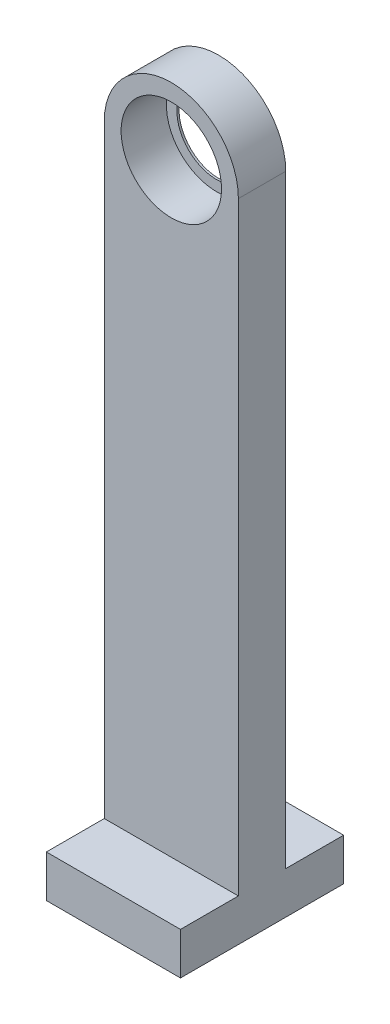
ISO-10303-21;
HEADER;
FILE_DESCRIPTION(('STEP AP214'),'2;1');
FILE_NAME('part.step','',(''),(''),'','','');
FILE_SCHEMA(('AUTOMOTIVE_DESIGN { 1 0 10303 214 1 1 1 1 }'));
ENDSEC;
DATA;
#1=APPLICATION_CONTEXT('core data for automotive mechanical design processes');
#2=APPLICATION_PROTOCOL_DEFINITION('international standard','automotive_design',2000,#1);
#3=PRODUCT_CONTEXT('',#1,'mechanical');
#4=PRODUCT('Part','Part','',(#3));
#5=PRODUCT_RELATED_PRODUCT_CATEGORY('part','',(#4));
#6=PRODUCT_DEFINITION_FORMATION('','',#4);
#7=PRODUCT_DEFINITION_CONTEXT('part definition',#1,'design');
#8=PRODUCT_DEFINITION('design','',#6,#7);
#9=PRODUCT_DEFINITION_SHAPE('','',#8);
#10=(LENGTH_UNIT() NAMED_UNIT(*) SI_UNIT(.MILLI.,.METRE.));
#11=(NAMED_UNIT(*) PLANE_ANGLE_UNIT() SI_UNIT($,.RADIAN.));
#12=(NAMED_UNIT(*) SI_UNIT($,.STERADIAN.) SOLID_ANGLE_UNIT());
#13=UNCERTAINTY_MEASURE_WITH_UNIT(LENGTH_MEASURE(1.E-05),#10,'distance_accuracy_value','');
#14=(GEOMETRIC_REPRESENTATION_CONTEXT(3) GLOBAL_UNCERTAINTY_ASSIGNED_CONTEXT((#13)) GLOBAL_UNIT_ASSIGNED_CONTEXT((#10,
#11,#12)) REPRESENTATION_CONTEXT('',''));
#15=CARTESIAN_POINT('',(0.,0.,0.));
#16=DIRECTION('',(0.,0.,1.));
#17=DIRECTION('',(1.,0.,0.));
#18=AXIS2_PLACEMENT_3D('',#15,#16,#17);
#19=CARTESIAN_POINT('',(0.,0.,4.5));
#20=DIRECTION('',(0.,0.,1.));
#21=DIRECTION('',(1.,0.,0.));
#22=AXIS2_PLACEMENT_3D('',#19,#20,#21);
#23=PLANE('',#22);
#24=DIRECTION('',(-1.,0.,0.));
#25=VECTOR('',#24,1.);
#26=CARTESIAN_POINT('',(0.,-57.37,4.5));
#27=LINE('',#26,#25);
#28=CARTESIAN_POINT('',(6.37005528205707,-57.37,4.5));
#29=VERTEX_POINT('',#28);
#30=CARTESIAN_POINT('',(-6.37005528205707,-57.37,4.5));
#31=VERTEX_POINT('',#30);
#32=EDGE_CURVE('E132',#29,#31,#27,.T.);
#33=ORIENTED_EDGE('',*,*,#32,.F.);
#34=DIRECTION('',(0.,-1.,0.));
#35=VECTOR('',#34,1.);
#36=CARTESIAN_POINT('',(6.37005528205707,0.,4.5));
#37=LINE('',#36,#35);
#38=CARTESIAN_POINT('',(6.37005528205707,0.,4.5));
#39=VERTEX_POINT('',#38);
#40=EDGE_CURVE('E134',#39,#29,#37,.T.);
#41=ORIENTED_EDGE('',*,*,#40,.F.);
#42=CARTESIAN_POINT('',(0.,0.,4.5));
#43=DIRECTION('',(0.,0.,1.));
#44=DIRECTION('',(1.,0.,0.));
#45=AXIS2_PLACEMENT_3D('',#42,#43,#44);
#46=CIRCLE('',#45,6.37005528205707);
#47=CARTESIAN_POINT('',(-6.37005528205707,0.,4.5));
#48=VERTEX_POINT('',#47);
#49=EDGE_CURVE('E24',#39,#48,#46,.T.);
#50=ORIENTED_EDGE('',*,*,#49,.T.);
#51=DIRECTION('',(0.,1.,0.));
#52=VECTOR('',#51,1.);
#53=CARTESIAN_POINT('',(-6.37005528205707,0.,4.5));
#54=LINE('',#53,#52);
#55=EDGE_CURVE('E90',#31,#48,#54,.T.);
#56=ORIENTED_EDGE('',*,*,#55,.F.);
#57=EDGE_LOOP('',(#33,#41,#50,#56));
#58=FACE_BOUND('',#57,.T.);
#59=CARTESIAN_POINT('',(0.,0.,4.5));
#60=DIRECTION('',(0.,0.,1.));
#61=DIRECTION('',(1.,0.,0.));
#62=AXIS2_PLACEMENT_3D('',#59,#60,#61);
#63=CIRCLE('',#62,4.77);
#64=CARTESIAN_POINT('',(4.77,0.,4.5));
#65=VERTEX_POINT('',#64);
#66=EDGE_CURVE('E147',#65,#65,#63,.T.);
#67=ORIENTED_EDGE('',*,*,#66,.F.);
#68=EDGE_LOOP('',(#67));
#69=FACE_BOUND('',#68,.T.);
#70=ADVANCED_FACE('F16',(#58,#69),#23,.T.);
#71=CARTESIAN_POINT('',(0.,0.,0.));
#72=DIRECTION('',(0.,0.,1.));
#73=DIRECTION('',(1.,0.,0.));
#74=AXIS2_PLACEMENT_3D('',#71,#72,#73);
#75=PLANE('',#74);
#76=DIRECTION('',(0.,-1.,0.));
#77=VECTOR('',#76,1.);
#78=CARTESIAN_POINT('',(6.37005528205707,0.,0.));
#79=LINE('',#78,#77);
#80=CARTESIAN_POINT('',(6.37005528205707,0.,0.));
#81=VERTEX_POINT('',#80);
#82=CARTESIAN_POINT('',(6.37005528205708,-57.37,0.));
#83=VERTEX_POINT('',#82);
#84=EDGE_CURVE('E31',#81,#83,#79,.T.);
#85=ORIENTED_EDGE('',*,*,#84,.T.);
#86=DIRECTION('',(-1.,0.,0.));
#87=VECTOR('',#86,1.);
#88=CARTESIAN_POINT('',(0.,-57.37,0.));
#89=LINE('',#88,#87);
#90=CARTESIAN_POINT('',(-6.37005528205707,-57.37,0.));
#91=VERTEX_POINT('',#90);
#92=EDGE_CURVE('E35',#83,#91,#89,.T.);
#93=ORIENTED_EDGE('',*,*,#92,.T.);
#94=DIRECTION('',(0.,1.,0.));
#95=VECTOR('',#94,1.);
#96=CARTESIAN_POINT('',(-6.37005528205707,0.,0.));
#97=LINE('',#96,#95);
#98=CARTESIAN_POINT('',(-6.37005528205707,0.,0.));
#99=VERTEX_POINT('',#98);
#100=EDGE_CURVE('E136',#91,#99,#97,.T.);
#101=ORIENTED_EDGE('',*,*,#100,.T.);
#102=CARTESIAN_POINT('',(0.,0.,0.));
#103=DIRECTION('',(0.,0.,1.));
#104=DIRECTION('',(1.,0.,0.));
#105=AXIS2_PLACEMENT_3D('',#102,#103,#104);
#106=CIRCLE('',#105,6.37005528205707);
#107=EDGE_CURVE('E150',#81,#99,#106,.T.);
#108=ORIENTED_EDGE('',*,*,#107,.F.);
#109=EDGE_LOOP('',(#85,#93,#101,#108));
#110=FACE_BOUND('',#109,.T.);
#111=CARTESIAN_POINT('',(0.,0.,0.));
#112=DIRECTION('',(0.,0.,1.));
#113=DIRECTION('',(1.,0.,0.));
#114=AXIS2_PLACEMENT_3D('',#111,#112,#113);
#115=CIRCLE('',#114,3.77);
#116=CARTESIAN_POINT('',(3.77,0.,0.));
#117=VERTEX_POINT('',#116);
#118=EDGE_CURVE('E109',#117,#117,#115,.T.);
#119=ORIENTED_EDGE('',*,*,#118,.T.);
#120=EDGE_LOOP('',(#119));
#121=FACE_BOUND('',#120,.T.);
#122=ADVANCED_FACE('F183',(#110,#121),#75,.F.);
#123=CARTESIAN_POINT('',(0.,0.,4.5));
#124=DIRECTION('',(0.,0.,-1.));
#125=DIRECTION('',(-1.,0.,0.));
#126=AXIS2_PLACEMENT_3D('',#123,#124,#125);
#127=CYLINDRICAL_SURFACE('',#126,6.37005528205707);
#128=ORIENTED_EDGE('',*,*,#49,.F.);
#129=DIRECTION('',(0.,0.,-1.));
#130=VECTOR('',#129,1.);
#131=CARTESIAN_POINT('',(6.37005528205707,0.,4.5));
#132=LINE('',#131,#130);
#133=EDGE_CURVE('E144',#39,#81,#132,.T.);
#134=ORIENTED_EDGE('',*,*,#133,.T.);
#135=ORIENTED_EDGE('',*,*,#107,.T.);
#136=DIRECTION('',(0.,0.,-1.));
#137=VECTOR('',#136,1.);
#138=CARTESIAN_POINT('',(-6.37005528205707,0.,4.5));
#139=LINE('',#138,#137);
#140=EDGE_CURVE('E141',#48,#99,#139,.T.);
#141=ORIENTED_EDGE('',*,*,#140,.F.);
#142=EDGE_LOOP('',(#128,#134,#135,#141));
#143=FACE_BOUND('',#142,.T.);
#144=ADVANCED_FACE('F18',(#143),#127,.T.);
#145=CARTESIAN_POINT('',(0.,0.,4.5));
#146=DIRECTION('',(0.,0.,-1.));
#147=DIRECTION('',(-1.,0.,0.));
#148=AXIS2_PLACEMENT_3D('',#145,#146,#147);
#149=CYLINDRICAL_SURFACE('',#148,4.77);
#150=CARTESIAN_POINT('',(0.,0.,0.2));
#151=DIRECTION('',(0.,0.,1.));
#152=DIRECTION('',(1.,0.,0.));
#153=AXIS2_PLACEMENT_3D('',#150,#151,#152);
#154=CIRCLE('',#153,4.77);
#155=CARTESIAN_POINT('',(4.77,0.,0.2));
#156=VERTEX_POINT('',#155);
#157=EDGE_CURVE('E10',#156,#156,#154,.T.);
#158=ORIENTED_EDGE('',*,*,#157,.F.);
#159=EDGE_LOOP('',(#158));
#160=FACE_BOUND('',#159,.T.);
#161=ORIENTED_EDGE('',*,*,#66,.T.);
#162=EDGE_LOOP('',(#161));
#163=FACE_BOUND('',#162,.T.);
#164=ADVANCED_FACE('F190',(#160,#163),#149,.F.);
#165=CARTESIAN_POINT('',(6.37005528205707,0.,4.5));
#166=DIRECTION('',(1.,0.,0.));
#167=DIRECTION('',(0.,1.,0.));
#168=AXIS2_PLACEMENT_3D('',#165,#166,#167);
#169=PLANE('',#168);
#170=ORIENTED_EDGE('',*,*,#40,.T.);
#171=DIRECTION('',(0.,0.,1.));
#172=VECTOR('',#171,1.);
#173=CARTESIAN_POINT('',(6.37005528205707,-57.37,-5.5));
#174=LINE('',#173,#172);
#175=CARTESIAN_POINT('',(6.37005528205707,-57.37,10.));
#176=VERTEX_POINT('',#175);
#177=EDGE_CURVE('E96',#29,#176,#174,.T.);
#178=ORIENTED_EDGE('',*,*,#177,.T.);
#179=DIRECTION('',(0.,1.,0.));
#180=VECTOR('',#179,1.);
#181=CARTESIAN_POINT('',(6.37005528205708,-61.37,10.));
#182=LINE('',#181,#180);
#183=CARTESIAN_POINT('',(6.37005528205708,-61.37,10.));
#184=VERTEX_POINT('',#183);
#185=EDGE_CURVE('E93',#184,#176,#182,.T.);
#186=ORIENTED_EDGE('',*,*,#185,.F.);
#187=DIRECTION('',(0.,0.,-1.));
#188=VECTOR('',#187,1.);
#189=CARTESIAN_POINT('',(6.37005528205708,-61.37,4.5));
#190=LINE('',#189,#188);
#191=CARTESIAN_POINT('',(6.37005528205708,-61.37,-5.5));
#192=VERTEX_POINT('',#191);
#193=EDGE_CURVE('E79',#184,#192,#190,.T.);
#194=ORIENTED_EDGE('',*,*,#193,.T.);
#195=DIRECTION('',(0.,1.,0.));
#196=VECTOR('',#195,1.);
#197=CARTESIAN_POINT('',(6.37005528205708,-61.37,-5.5));
#198=LINE('',#197,#196);
#199=CARTESIAN_POINT('',(6.37005528205707,-57.37,-5.5));
#200=VERTEX_POINT('',#199);
#201=EDGE_CURVE('E116',#192,#200,#198,.T.);
#202=ORIENTED_EDGE('',*,*,#201,.T.);
#203=EDGE_CURVE('E128',#200,#83,#174,.T.);
#204=ORIENTED_EDGE('',*,*,#203,.T.);
#205=ORIENTED_EDGE('',*,*,#84,.F.);
#206=ORIENTED_EDGE('',*,*,#133,.F.);
#207=EDGE_LOOP('',(#170,#178,#186,#194,#202,#204,#205,#206));
#208=FACE_BOUND('',#207,.T.);
#209=ADVANCED_FACE('F95',(#208),#169,.T.);
#210=CARTESIAN_POINT('',(-6.37005528205707,0.,4.5));
#211=DIRECTION('',(-1.,0.,0.));
#212=DIRECTION('',(0.,0.,1.));
#213=AXIS2_PLACEMENT_3D('',#210,#211,#212);
#214=PLANE('',#213);
#215=ORIENTED_EDGE('',*,*,#100,.F.);
#216=DIRECTION('',(0.,0.,1.));
#217=VECTOR('',#216,1.);
#218=CARTESIAN_POINT('',(-6.37005528205707,-57.37,-5.5));
#219=LINE('',#218,#217);
#220=CARTESIAN_POINT('',(-6.37005528205707,-57.37,-5.5));
#221=VERTEX_POINT('',#220);
#222=EDGE_CURVE('E124',#221,#91,#219,.T.);
#223=ORIENTED_EDGE('',*,*,#222,.F.);
#224=DIRECTION('',(0.,-1.,0.));
#225=VECTOR('',#224,1.);
#226=CARTESIAN_POINT('',(-6.37005528205707,-57.37,-5.5));
#227=LINE('',#226,#225);
#228=CARTESIAN_POINT('',(-6.37005528205707,-61.37,-5.5));
#229=VERTEX_POINT('',#228);
#230=EDGE_CURVE('E121',#221,#229,#227,.T.);
#231=ORIENTED_EDGE('',*,*,#230,.T.);
#232=DIRECTION('',(0.,0.,-1.));
#233=VECTOR('',#232,1.);
#234=CARTESIAN_POINT('',(-6.37005528205707,-61.37,4.5));
#235=LINE('',#234,#233);
#236=CARTESIAN_POINT('',(-6.37005528205707,-61.37,10.));
#237=VERTEX_POINT('',#236);
#238=EDGE_CURVE('E89',#237,#229,#235,.T.);
#239=ORIENTED_EDGE('',*,*,#238,.F.);
#240=DIRECTION('',(0.,-1.,0.));
#241=VECTOR('',#240,1.);
#242=CARTESIAN_POINT('',(-6.37005528205707,-57.37,10.));
#243=LINE('',#242,#241);
#244=CARTESIAN_POINT('',(-6.37005528205707,-57.37,10.));
#245=VERTEX_POINT('',#244);
#246=EDGE_CURVE('E105',#245,#237,#243,.T.);
#247=ORIENTED_EDGE('',*,*,#246,.F.);
#248=EDGE_CURVE('E127',#31,#245,#219,.T.);
#249=ORIENTED_EDGE('',*,*,#248,.F.);
#250=ORIENTED_EDGE('',*,*,#55,.T.);
#251=ORIENTED_EDGE('',*,*,#140,.T.);
#252=EDGE_LOOP('',(#215,#223,#231,#239,#247,#249,#250,#251));
#253=FACE_BOUND('',#252,.T.);
#254=ADVANCED_FACE('F157',(#253),#214,.T.);
#255=CARTESIAN_POINT('',(0.,-61.37,4.5));
#256=DIRECTION('',(0.,-1.,0.));
#257=DIRECTION('',(0.,0.,-1.));
#258=AXIS2_PLACEMENT_3D('',#255,#256,#257);
#259=PLANE('',#258);
#260=ORIENTED_EDGE('',*,*,#238,.T.);
#261=DIRECTION('',(1.,0.,0.));
#262=VECTOR('',#261,1.);
#263=CARTESIAN_POINT('',(-6.37005528205707,-61.37,-5.5));
#264=LINE('',#263,#262);
#265=EDGE_CURVE('E85',#229,#192,#264,.T.);
#266=ORIENTED_EDGE('',*,*,#265,.T.);
#267=ORIENTED_EDGE('',*,*,#193,.F.);
#268=DIRECTION('',(1.,0.,0.));
#269=VECTOR('',#268,1.);
#270=CARTESIAN_POINT('',(-6.37005528205707,-61.37,10.));
#271=LINE('',#270,#269);
#272=EDGE_CURVE('E83',#237,#184,#271,.T.);
#273=ORIENTED_EDGE('',*,*,#272,.F.);
#274=EDGE_LOOP('',(#260,#266,#267,#273));
#275=FACE_BOUND('',#274,.T.);
#276=ADVANCED_FACE('F81',(#275),#259,.T.);
#277=CARTESIAN_POINT('',(0.,0.,-5.5));
#278=DIRECTION('',(0.,0.,1.));
#279=DIRECTION('',(1.,0.,0.));
#280=AXIS2_PLACEMENT_3D('',#277,#278,#279);
#281=PLANE('',#280);
#282=ORIENTED_EDGE('',*,*,#265,.F.);
#283=ORIENTED_EDGE('',*,*,#230,.F.);
#284=DIRECTION('',(-1.,0.,0.));
#285=VECTOR('',#284,1.);
#286=CARTESIAN_POINT('',(6.37005528205707,-57.37,-5.5));
#287=LINE('',#286,#285);
#288=EDGE_CURVE('E118',#200,#221,#287,.T.);
#289=ORIENTED_EDGE('',*,*,#288,.F.);
#290=ORIENTED_EDGE('',*,*,#201,.F.);
#291=EDGE_LOOP('',(#282,#283,#289,#290));
#292=FACE_BOUND('',#291,.T.);
#293=ADVANCED_FACE('F169',(#292),#281,.F.);
#294=CARTESIAN_POINT('',(6.37005528205707,-57.37,-5.5));
#295=DIRECTION('',(0.,1.,0.));
#296=DIRECTION('',(0.,0.,1.));
#297=AXIS2_PLACEMENT_3D('',#294,#295,#296);
#298=PLANE('',#297);
#299=ORIENTED_EDGE('',*,*,#92,.F.);
#300=ORIENTED_EDGE('',*,*,#203,.F.);
#301=ORIENTED_EDGE('',*,*,#288,.T.);
#302=ORIENTED_EDGE('',*,*,#222,.T.);
#303=EDGE_LOOP('',(#299,#300,#301,#302));
#304=FACE_BOUND('',#303,.T.);
#305=ADVANCED_FACE('F166',(#304),#298,.T.);
#306=ORIENTED_EDGE('',*,*,#177,.F.);
#307=ORIENTED_EDGE('',*,*,#32,.T.);
#308=ORIENTED_EDGE('',*,*,#248,.T.);
#309=DIRECTION('',(-1.,0.,0.));
#310=VECTOR('',#309,1.);
#311=CARTESIAN_POINT('',(6.37005528205707,-57.37,10.));
#312=LINE('',#311,#310);
#313=EDGE_CURVE('E100',#176,#245,#312,.T.);
#314=ORIENTED_EDGE('',*,*,#313,.F.);
#315=EDGE_LOOP('',(#306,#307,#308,#314));
#316=FACE_BOUND('',#315,.T.);
#317=ADVANCED_FACE('F178',(#316),#298,.T.);
#318=CARTESIAN_POINT('',(0.,0.,10.));
#319=DIRECTION('',(0.,0.,1.));
#320=DIRECTION('',(1.,0.,0.));
#321=AXIS2_PLACEMENT_3D('',#318,#319,#320);
#322=PLANE('',#321);
#323=ORIENTED_EDGE('',*,*,#272,.T.);
#324=ORIENTED_EDGE('',*,*,#185,.T.);
#325=ORIENTED_EDGE('',*,*,#313,.T.);
#326=ORIENTED_EDGE('',*,*,#246,.T.);
#327=EDGE_LOOP('',(#323,#324,#325,#326));
#328=FACE_BOUND('',#327,.T.);
#329=ADVANCED_FACE('F103',(#328),#322,.T.);
#330=CARTESIAN_POINT('',(0.,0.,0.2));
#331=DIRECTION('',(0.,0.,1.));
#332=DIRECTION('',(1.,0.,0.));
#333=AXIS2_PLACEMENT_3D('',#330,#331,#332);
#334=PLANE('',#333);
#335=ORIENTED_EDGE('',*,*,#157,.T.);
#336=EDGE_LOOP('',(#335));
#337=FACE_BOUND('',#336,.T.);
#338=CARTESIAN_POINT('',(0.,0.,0.2));
#339=DIRECTION('',(0.,0.,1.));
#340=DIRECTION('',(1.,0.,0.));
#341=AXIS2_PLACEMENT_3D('',#338,#339,#340);
#342=CIRCLE('',#341,3.77);
#343=CARTESIAN_POINT('',(3.77,0.,0.2));
#344=VERTEX_POINT('',#343);
#345=EDGE_CURVE('E106',#344,#344,#342,.T.);
#346=ORIENTED_EDGE('',*,*,#345,.F.);
#347=EDGE_LOOP('',(#346));
#348=FACE_BOUND('',#347,.T.);
#349=ADVANCED_FACE('F203',(#337,#348),#334,.T.);
#350=CARTESIAN_POINT('',(0.,0.,0.2));
#351=DIRECTION('',(0.,0.,-1.));
#352=DIRECTION('',(-1.,0.,0.));
#353=AXIS2_PLACEMENT_3D('',#350,#351,#352);
#354=CYLINDRICAL_SURFACE('',#353,3.77);
#355=ORIENTED_EDGE('',*,*,#345,.T.);
#356=EDGE_LOOP('',(#355));
#357=FACE_BOUND('',#356,.T.);
#358=ORIENTED_EDGE('',*,*,#118,.F.);
#359=EDGE_LOOP('',(#358));
#360=FACE_BOUND('',#359,.T.);
#361=ADVANCED_FACE('F208',(#357,#360),#354,.F.);
#362=CLOSED_SHELL('',(#70,#122,#144,#164,#209,#254,#276,#293,#305,#317,#329,#349,#361));
#363=MANIFOLD_SOLID_BREP('B1',#362);
#364=ADVANCED_BREP_SHAPE_REPRESENTATION('',(#18,#363),#14);
#365=SHAPE_DEFINITION_REPRESENTATION(#9,#364);
ENDSEC;
END-ISO-10303-21;
